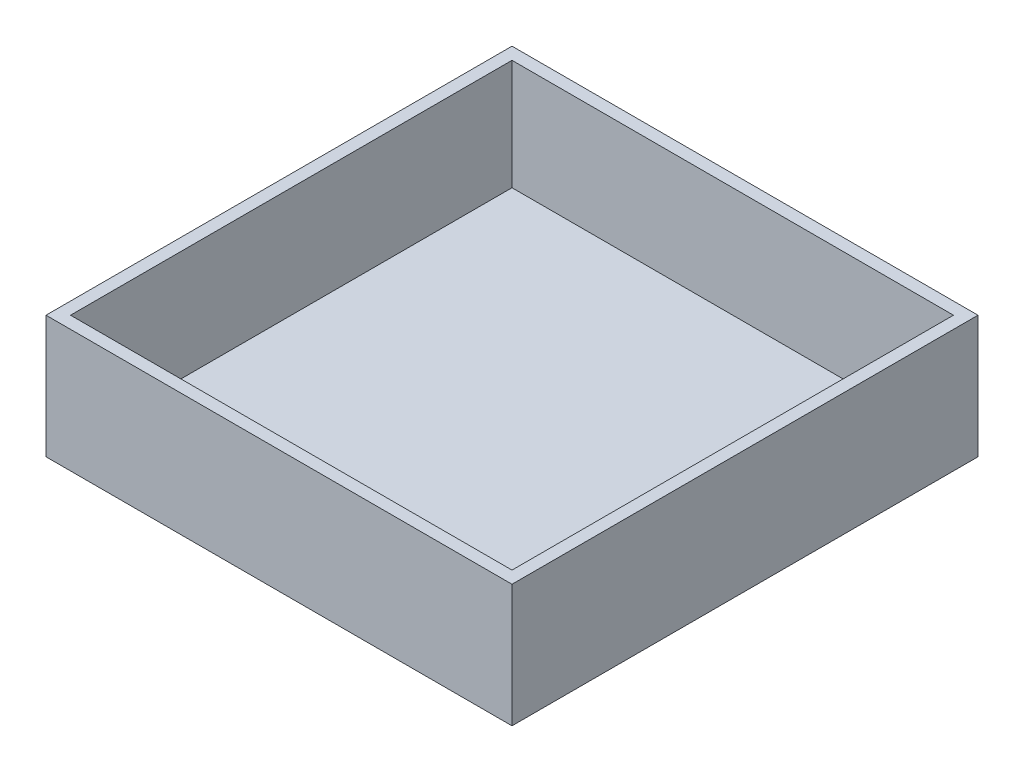
ISO-10303-21;
HEADER;
FILE_DESCRIPTION(('STEP AP214'),'2;1');
FILE_NAME('part.step','',(''),(''),'','','');
FILE_SCHEMA(('AUTOMOTIVE_DESIGN { 1 0 10303 214 1 1 1 1 }'));
ENDSEC;
DATA;
#1=APPLICATION_CONTEXT('core data for automotive mechanical design processes');
#2=APPLICATION_PROTOCOL_DEFINITION('international standard','automotive_design',2000,#1);
#3=PRODUCT_CONTEXT('',#1,'mechanical');
#4=PRODUCT('Part','Part','',(#3));
#5=PRODUCT_RELATED_PRODUCT_CATEGORY('part','',(#4));
#6=PRODUCT_DEFINITION_FORMATION('','',#4);
#7=PRODUCT_DEFINITION_CONTEXT('part definition',#1,'design');
#8=PRODUCT_DEFINITION('design','',#6,#7);
#9=PRODUCT_DEFINITION_SHAPE('','',#8);
#10=(LENGTH_UNIT() NAMED_UNIT(*) SI_UNIT(.MILLI.,.METRE.));
#11=(NAMED_UNIT(*) PLANE_ANGLE_UNIT() SI_UNIT($,.RADIAN.));
#12=(NAMED_UNIT(*) SI_UNIT($,.STERADIAN.) SOLID_ANGLE_UNIT());
#13=UNCERTAINTY_MEASURE_WITH_UNIT(LENGTH_MEASURE(1.E-05),#10,'distance_accuracy_value','');
#14=(GEOMETRIC_REPRESENTATION_CONTEXT(3) GLOBAL_UNCERTAINTY_ASSIGNED_CONTEXT((#13)) GLOBAL_UNIT_ASSIGNED_CONTEXT((#10,
#11,#12)) REPRESENTATION_CONTEXT('',''));
#15=CARTESIAN_POINT('',(0.,0.,0.));
#16=DIRECTION('',(0.,0.,1.));
#17=DIRECTION('',(1.,0.,0.));
#18=AXIS2_PLACEMENT_3D('',#15,#16,#17);
#19=CARTESIAN_POINT('',(0.,45.,0.));
#20=DIRECTION('',(0.,1.,0.));
#21=DIRECTION('',(0.,0.,1.));
#22=AXIS2_PLACEMENT_3D('',#19,#20,#21);
#23=PLANE('',#22);
#24=DIRECTION('',(1.,0.,0.));
#25=VECTOR('',#24,1.);
#26=CARTESIAN_POINT('',(-95.,45.,95.));
#27=LINE('',#26,#25);
#28=CARTESIAN_POINT('',(-95.,45.,95.));
#29=VERTEX_POINT('',#28);
#30=CARTESIAN_POINT('',(95.,45.,95.));
#31=VERTEX_POINT('',#30);
#32=EDGE_CURVE('E152',#29,#31,#27,.T.);
#33=ORIENTED_EDGE('',*,*,#32,.T.);
#34=DIRECTION('',(0.,0.,-1.));
#35=VECTOR('',#34,1.);
#36=CARTESIAN_POINT('',(95.,45.,95.));
#37=LINE('',#36,#35);
#38=CARTESIAN_POINT('',(95.,45.,-95.));
#39=VERTEX_POINT('',#38);
#40=EDGE_CURVE('E154',#31,#39,#37,.T.);
#41=ORIENTED_EDGE('',*,*,#40,.T.);
#42=DIRECTION('',(-1.,0.,0.));
#43=VECTOR('',#42,1.);
#44=CARTESIAN_POINT('',(-95.,45.,-95.));
#45=LINE('',#44,#43);
#46=CARTESIAN_POINT('',(-95.,45.,-95.));
#47=VERTEX_POINT('',#46);
#48=EDGE_CURVE('E156',#39,#47,#45,.T.);
#49=ORIENTED_EDGE('',*,*,#48,.T.);
#50=DIRECTION('',(0.,0.,1.));
#51=VECTOR('',#50,1.);
#52=CARTESIAN_POINT('',(-95.,45.,95.));
#53=LINE('',#52,#51);
#54=EDGE_CURVE('E56',#47,#29,#53,.T.);
#55=ORIENTED_EDGE('',*,*,#54,.T.);
#56=EDGE_LOOP('',(#33,#41,#49,#55));
#57=FACE_BOUND('',#56,.T.);
#58=DIRECTION('',(-1.,0.,0.));
#59=VECTOR('',#58,1.);
#60=CARTESIAN_POINT('',(-90.,45.,-90.));
#61=LINE('',#60,#59);
#62=CARTESIAN_POINT('',(90.,45.,-90.));
#63=VERTEX_POINT('',#62);
#64=CARTESIAN_POINT('',(-90.,45.,-90.));
#65=VERTEX_POINT('',#64);
#66=EDGE_CURVE('E127',#63,#65,#61,.T.);
#67=ORIENTED_EDGE('',*,*,#66,.F.);
#68=DIRECTION('',(0.,0.,-1.));
#69=VECTOR('',#68,1.);
#70=CARTESIAN_POINT('',(90.,45.,90.));
#71=LINE('',#70,#69);
#72=CARTESIAN_POINT('',(90.,45.,90.));
#73=VERTEX_POINT('',#72);
#74=EDGE_CURVE('E125',#73,#63,#71,.T.);
#75=ORIENTED_EDGE('',*,*,#74,.F.);
#76=DIRECTION('',(1.,0.,0.));
#77=VECTOR('',#76,1.);
#78=CARTESIAN_POINT('',(-90.,45.,90.));
#79=LINE('',#78,#77);
#80=CARTESIAN_POINT('',(-90.,45.,90.));
#81=VERTEX_POINT('',#80);
#82=EDGE_CURVE('E132',#81,#73,#79,.T.);
#83=ORIENTED_EDGE('',*,*,#82,.F.);
#84=DIRECTION('',(0.,0.,1.));
#85=VECTOR('',#84,1.);
#86=CARTESIAN_POINT('',(-90.,45.,90.));
#87=LINE('',#86,#85);
#88=EDGE_CURVE('E130',#65,#81,#87,.T.);
#89=ORIENTED_EDGE('',*,*,#88,.F.);
#90=EDGE_LOOP('',(#67,#75,#83,#89));
#91=FACE_BOUND('',#90,.T.);
#92=ADVANCED_FACE('F33',(#57,#91),#23,.T.);
#93=CARTESIAN_POINT('',(-95.,45.,95.));
#94=DIRECTION('',(0.,0.,-1.));
#95=DIRECTION('',(-1.,0.,0.));
#96=AXIS2_PLACEMENT_3D('',#93,#94,#95);
#97=PLANE('',#96);
#98=DIRECTION('',(0.,-1.,0.));
#99=VECTOR('',#98,1.);
#100=CARTESIAN_POINT('',(-95.,45.,95.));
#101=LINE('',#100,#99);
#102=CARTESIAN_POINT('',(-95.,-5.,95.));
#103=VERTEX_POINT('',#102);
#104=EDGE_CURVE('E105',#29,#103,#101,.T.);
#105=ORIENTED_EDGE('',*,*,#104,.T.);
#106=DIRECTION('',(-1.,0.,0.));
#107=VECTOR('',#106,1.);
#108=CARTESIAN_POINT('',(-95.,-5.,95.));
#109=LINE('',#108,#107);
#110=CARTESIAN_POINT('',(95.,-5.,95.));
#111=VERTEX_POINT('',#110);
#112=EDGE_CURVE('E119',#111,#103,#109,.T.);
#113=ORIENTED_EDGE('',*,*,#112,.F.);
#114=DIRECTION('',(0.,-1.,0.));
#115=VECTOR('',#114,1.);
#116=CARTESIAN_POINT('',(95.,45.,95.));
#117=LINE('',#116,#115);
#118=EDGE_CURVE('E11',#31,#111,#117,.T.);
#119=ORIENTED_EDGE('',*,*,#118,.F.);
#120=ORIENTED_EDGE('',*,*,#32,.F.);
#121=EDGE_LOOP('',(#105,#113,#119,#120));
#122=FACE_BOUND('',#121,.T.);
#123=ADVANCED_FACE('F35',(#122),#97,.F.);
#124=CARTESIAN_POINT('',(95.,45.,95.));
#125=DIRECTION('',(-1.,0.,0.));
#126=DIRECTION('',(0.,0.,1.));
#127=AXIS2_PLACEMENT_3D('',#124,#125,#126);
#128=PLANE('',#127);
#129=ORIENTED_EDGE('',*,*,#118,.T.);
#130=DIRECTION('',(0.,0.,1.));
#131=VECTOR('',#130,1.);
#132=CARTESIAN_POINT('',(95.,-5.,95.));
#133=LINE('',#132,#131);
#134=CARTESIAN_POINT('',(95.,-5.,-95.));
#135=VERTEX_POINT('',#134);
#136=EDGE_CURVE('E114',#135,#111,#133,.T.);
#137=ORIENTED_EDGE('',*,*,#136,.F.);
#138=DIRECTION('',(0.,-1.,0.));
#139=VECTOR('',#138,1.);
#140=CARTESIAN_POINT('',(95.,45.,-95.));
#141=LINE('',#140,#139);
#142=EDGE_CURVE('E41',#39,#135,#141,.T.);
#143=ORIENTED_EDGE('',*,*,#142,.F.);
#144=ORIENTED_EDGE('',*,*,#40,.F.);
#145=EDGE_LOOP('',(#129,#137,#143,#144));
#146=FACE_BOUND('',#145,.T.);
#147=ADVANCED_FACE('F164',(#146),#128,.F.);
#148=CARTESIAN_POINT('',(-95.,45.,-95.));
#149=DIRECTION('',(0.,0.,1.));
#150=DIRECTION('',(1.,0.,0.));
#151=AXIS2_PLACEMENT_3D('',#148,#149,#150);
#152=PLANE('',#151);
#153=ORIENTED_EDGE('',*,*,#142,.T.);
#154=DIRECTION('',(1.,0.,0.));
#155=VECTOR('',#154,1.);
#156=CARTESIAN_POINT('',(-95.,-5.,-95.));
#157=LINE('',#156,#155);
#158=CARTESIAN_POINT('',(-95.,-5.,-95.));
#159=VERTEX_POINT('',#158);
#160=EDGE_CURVE('E108',#159,#135,#157,.T.);
#161=ORIENTED_EDGE('',*,*,#160,.F.);
#162=DIRECTION('',(0.,-1.,0.));
#163=VECTOR('',#162,1.);
#164=CARTESIAN_POINT('',(-95.,45.,-95.));
#165=LINE('',#164,#163);
#166=EDGE_CURVE('E98',#47,#159,#165,.T.);
#167=ORIENTED_EDGE('',*,*,#166,.F.);
#168=ORIENTED_EDGE('',*,*,#48,.F.);
#169=EDGE_LOOP('',(#153,#161,#167,#168));
#170=FACE_BOUND('',#169,.T.);
#171=ADVANCED_FACE('F109',(#170),#152,.F.);
#172=CARTESIAN_POINT('',(-95.,45.,95.));
#173=DIRECTION('',(1.,0.,0.));
#174=DIRECTION('',(0.,0.,-1.));
#175=AXIS2_PLACEMENT_3D('',#172,#173,#174);
#176=PLANE('',#175);
#177=ORIENTED_EDGE('',*,*,#166,.T.);
#178=DIRECTION('',(0.,0.,-1.));
#179=VECTOR('',#178,1.);
#180=CARTESIAN_POINT('',(-95.,-5.,95.));
#181=LINE('',#180,#179);
#182=EDGE_CURVE('E102',#103,#159,#181,.T.);
#183=ORIENTED_EDGE('',*,*,#182,.F.);
#184=ORIENTED_EDGE('',*,*,#104,.F.);
#185=ORIENTED_EDGE('',*,*,#54,.F.);
#186=EDGE_LOOP('',(#177,#183,#184,#185));
#187=FACE_BOUND('',#186,.T.);
#188=ADVANCED_FACE('F100',(#187),#176,.F.);
#189=CARTESIAN_POINT('',(90.,45.,90.));
#190=DIRECTION('',(-1.,0.,0.));
#191=DIRECTION('',(0.,0.,1.));
#192=AXIS2_PLACEMENT_3D('',#189,#190,#191);
#193=PLANE('',#192);
#194=DIRECTION('',(0.,0.,-1.));
#195=VECTOR('',#194,1.);
#196=CARTESIAN_POINT('',(90.,0.,90.));
#197=LINE('',#196,#195);
#198=CARTESIAN_POINT('',(90.,0.,90.));
#199=VERTEX_POINT('',#198);
#200=CARTESIAN_POINT('',(90.,0.,-90.));
#201=VERTEX_POINT('',#200);
#202=EDGE_CURVE('E124',#199,#201,#197,.T.);
#203=ORIENTED_EDGE('',*,*,#202,.F.);
#204=DIRECTION('',(0.,-1.,0.));
#205=VECTOR('',#204,1.);
#206=CARTESIAN_POINT('',(90.,45.,90.));
#207=LINE('',#206,#205);
#208=EDGE_CURVE('E134',#73,#199,#207,.T.);
#209=ORIENTED_EDGE('',*,*,#208,.F.);
#210=ORIENTED_EDGE('',*,*,#74,.T.);
#211=DIRECTION('',(0.,-1.,0.));
#212=VECTOR('',#211,1.);
#213=CARTESIAN_POINT('',(90.,45.,-90.));
#214=LINE('',#213,#212);
#215=EDGE_CURVE('E149',#63,#201,#214,.T.);
#216=ORIENTED_EDGE('',*,*,#215,.T.);
#217=EDGE_LOOP('',(#203,#209,#210,#216));
#218=FACE_BOUND('',#217,.T.);
#219=ADVANCED_FACE('F177',(#218),#193,.T.);
#220=CARTESIAN_POINT('',(-90.,45.,-90.));
#221=DIRECTION('',(0.,0.,1.));
#222=DIRECTION('',(1.,0.,0.));
#223=AXIS2_PLACEMENT_3D('',#220,#221,#222);
#224=PLANE('',#223);
#225=DIRECTION('',(-1.,0.,0.));
#226=VECTOR('',#225,1.);
#227=CARTESIAN_POINT('',(-90.,0.,-90.));
#228=LINE('',#227,#226);
#229=CARTESIAN_POINT('',(-90.,0.,-90.));
#230=VERTEX_POINT('',#229);
#231=EDGE_CURVE('E137',#201,#230,#228,.T.);
#232=ORIENTED_EDGE('',*,*,#231,.F.);
#233=ORIENTED_EDGE('',*,*,#215,.F.);
#234=ORIENTED_EDGE('',*,*,#66,.T.);
#235=DIRECTION('',(0.,-1.,0.));
#236=VECTOR('',#235,1.);
#237=CARTESIAN_POINT('',(-90.,45.,-90.));
#238=LINE('',#237,#236);
#239=EDGE_CURVE('E147',#65,#230,#238,.T.);
#240=ORIENTED_EDGE('',*,*,#239,.T.);
#241=EDGE_LOOP('',(#232,#233,#234,#240));
#242=FACE_BOUND('',#241,.T.);
#243=ADVANCED_FACE('F183',(#242),#224,.T.);
#244=CARTESIAN_POINT('',(-90.,45.,90.));
#245=DIRECTION('',(1.,0.,0.));
#246=DIRECTION('',(0.,0.,-1.));
#247=AXIS2_PLACEMENT_3D('',#244,#245,#246);
#248=PLANE('',#247);
#249=DIRECTION('',(0.,0.,1.));
#250=VECTOR('',#249,1.);
#251=CARTESIAN_POINT('',(-90.,0.,90.));
#252=LINE('',#251,#250);
#253=CARTESIAN_POINT('',(-90.,0.,90.));
#254=VERTEX_POINT('',#253);
#255=EDGE_CURVE('E140',#230,#254,#252,.T.);
#256=ORIENTED_EDGE('',*,*,#255,.F.);
#257=ORIENTED_EDGE('',*,*,#239,.F.);
#258=ORIENTED_EDGE('',*,*,#88,.T.);
#259=DIRECTION('',(0.,-1.,0.));
#260=VECTOR('',#259,1.);
#261=CARTESIAN_POINT('',(-90.,45.,90.));
#262=LINE('',#261,#260);
#263=EDGE_CURVE('E48',#81,#254,#262,.T.);
#264=ORIENTED_EDGE('',*,*,#263,.T.);
#265=EDGE_LOOP('',(#256,#257,#258,#264));
#266=FACE_BOUND('',#265,.T.);
#267=ADVANCED_FACE('F188',(#266),#248,.T.);
#268=CARTESIAN_POINT('',(-90.,45.,90.));
#269=DIRECTION('',(0.,0.,-1.));
#270=DIRECTION('',(-1.,0.,0.));
#271=AXIS2_PLACEMENT_3D('',#268,#269,#270);
#272=PLANE('',#271);
#273=DIRECTION('',(1.,0.,0.));
#274=VECTOR('',#273,1.);
#275=CARTESIAN_POINT('',(-90.,0.,90.));
#276=LINE('',#275,#274);
#277=EDGE_CURVE('E128',#254,#199,#276,.T.);
#278=ORIENTED_EDGE('',*,*,#277,.F.);
#279=ORIENTED_EDGE('',*,*,#263,.F.);
#280=ORIENTED_EDGE('',*,*,#82,.T.);
#281=ORIENTED_EDGE('',*,*,#208,.T.);
#282=EDGE_LOOP('',(#278,#279,#280,#281));
#283=FACE_BOUND('',#282,.T.);
#284=ADVANCED_FACE('F197',(#283),#272,.T.);
#285=CARTESIAN_POINT('',(0.,0.,0.));
#286=DIRECTION('',(0.,-1.,0.));
#287=DIRECTION('',(0.,0.,-1.));
#288=AXIS2_PLACEMENT_3D('',#285,#286,#287);
#289=PLANE('',#288);
#290=ORIENTED_EDGE('',*,*,#277,.T.);
#291=ORIENTED_EDGE('',*,*,#202,.T.);
#292=ORIENTED_EDGE('',*,*,#231,.T.);
#293=ORIENTED_EDGE('',*,*,#255,.T.);
#294=EDGE_LOOP('',(#290,#291,#292,#293));
#295=FACE_BOUND('',#294,.T.);
#296=ADVANCED_FACE('F195',(#295),#289,.F.);
#297=CARTESIAN_POINT('',(0.,-5.,0.));
#298=DIRECTION('',(0.,-1.,0.));
#299=DIRECTION('',(0.,0.,-1.));
#300=AXIS2_PLACEMENT_3D('',#297,#298,#299);
#301=PLANE('',#300);
#302=ORIENTED_EDGE('',*,*,#182,.T.);
#303=ORIENTED_EDGE('',*,*,#160,.T.);
#304=ORIENTED_EDGE('',*,*,#136,.T.);
#305=ORIENTED_EDGE('',*,*,#112,.T.);
#306=EDGE_LOOP('',(#302,#303,#304,#305));
#307=FACE_BOUND('',#306,.T.);
#308=ADVANCED_FACE('F117',(#307),#301,.T.);
#309=CLOSED_SHELL('',(#92,#123,#147,#171,#188,#219,#243,#267,#284,#296,#308));
#310=MANIFOLD_SOLID_BREP('B2',#309);
#311=ADVANCED_BREP_SHAPE_REPRESENTATION('',(#18,#310),#14);
#312=SHAPE_DEFINITION_REPRESENTATION(#9,#311);
ENDSEC;
END-ISO-10303-21;
